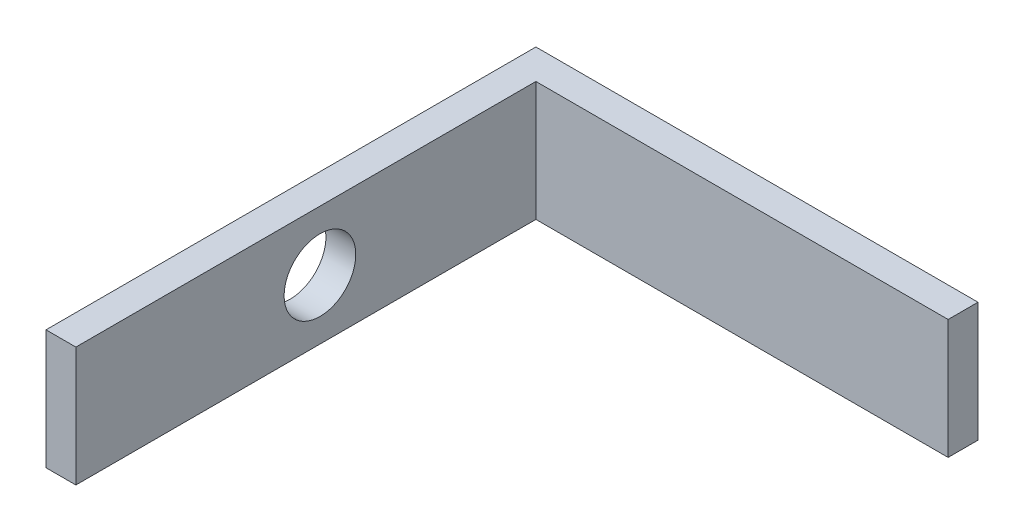
ISO-10303-21;
HEADER;
FILE_DESCRIPTION(('STEP AP214'),'2;1');
FILE_NAME('part.step','',(''),(''),'','','');
FILE_SCHEMA(('AUTOMOTIVE_DESIGN { 1 0 10303 214 1 1 1 1 }'));
ENDSEC;
DATA;
#1=APPLICATION_CONTEXT('core data for automotive mechanical design processes');
#2=APPLICATION_PROTOCOL_DEFINITION('international standard','automotive_design',2000,#1);
#3=PRODUCT_CONTEXT('',#1,'mechanical');
#4=PRODUCT('Part','Part','',(#3));
#5=PRODUCT_RELATED_PRODUCT_CATEGORY('part','',(#4));
#6=PRODUCT_DEFINITION_FORMATION('','',#4);
#7=PRODUCT_DEFINITION_CONTEXT('part definition',#1,'design');
#8=PRODUCT_DEFINITION('design','',#6,#7);
#9=PRODUCT_DEFINITION_SHAPE('','',#8);
#10=(LENGTH_UNIT() NAMED_UNIT(*) SI_UNIT(.MILLI.,.METRE.));
#11=(NAMED_UNIT(*) PLANE_ANGLE_UNIT() SI_UNIT($,.RADIAN.));
#12=(NAMED_UNIT(*) SI_UNIT($,.STERADIAN.) SOLID_ANGLE_UNIT());
#13=UNCERTAINTY_MEASURE_WITH_UNIT(LENGTH_MEASURE(1.E-05),#10,'distance_accuracy_value','');
#14=(GEOMETRIC_REPRESENTATION_CONTEXT(3) GLOBAL_UNCERTAINTY_ASSIGNED_CONTEXT((#13)) GLOBAL_UNIT_ASSIGNED_CONTEXT((#10,
#11,#12)) REPRESENTATION_CONTEXT('',''));
#15=CARTESIAN_POINT('',(0.,0.,0.));
#16=DIRECTION('',(0.,0.,1.));
#17=DIRECTION('',(1.,0.,0.));
#18=AXIS2_PLACEMENT_3D('',#15,#16,#17);
#19=CARTESIAN_POINT('',(-2.75770809575521,7.9375,-45.2264127703854));
#20=DIRECTION('',(0.,0.,1.));
#21=DIRECTION('',(1.,0.,0.));
#22=AXIS2_PLACEMENT_3D('',#19,#20,#21);
#23=PLANE('',#22);
#24=DIRECTION('',(-1.,0.,0.));
#25=VECTOR('',#24,1.);
#26=CARTESIAN_POINT('',(-2.75770809575521,-7.9375,-45.2264127703854));
#27=LINE('',#26,#25);
#28=CARTESIAN_POINT('',(55.9797919042448,-7.9375,-45.2264127703854));
#29=VERTEX_POINT('',#28);
#30=CARTESIAN_POINT('',(-2.75770809575521,-7.9375,-45.2264127703854));
#31=VERTEX_POINT('',#30);
#32=EDGE_CURVE('E86',#29,#31,#27,.T.);
#33=ORIENTED_EDGE('',*,*,#32,.T.);
#34=DIRECTION('',(0.,-1.,0.));
#35=VECTOR('',#34,1.);
#36=CARTESIAN_POINT('',(-2.75770809575521,7.9375,-45.2264127703854));
#37=LINE('',#36,#35);
#38=CARTESIAN_POINT('',(-2.75770809575521,7.9375,-45.2264127703854));
#39=VERTEX_POINT('',#38);
#40=EDGE_CURVE('E11',#39,#31,#37,.T.);
#41=ORIENTED_EDGE('',*,*,#40,.F.);
#42=DIRECTION('',(-1.,0.,0.));
#43=VECTOR('',#42,1.);
#44=CARTESIAN_POINT('',(6.27967860958227,7.9375,-45.2264127703854));
#45=LINE('',#44,#43);
#46=CARTESIAN_POINT('',(55.9797919042448,7.9375,-45.2264127703854));
#47=VERTEX_POINT('',#46);
#48=EDGE_CURVE('E92',#47,#39,#45,.T.);
#49=ORIENTED_EDGE('',*,*,#48,.F.);
#50=DIRECTION('',(0.,-1.,0.));
#51=VECTOR('',#50,1.);
#52=CARTESIAN_POINT('',(55.9797919042448,7.9375,-45.2264127703854));
#53=LINE('',#52,#51);
#54=EDGE_CURVE('E124',#47,#29,#53,.T.);
#55=ORIENTED_EDGE('',*,*,#54,.T.);
#56=EDGE_LOOP('',(#33,#41,#49,#55));
#57=FACE_BOUND('',#56,.T.);
#58=ADVANCED_FACE('F39',(#57),#23,.F.);
#59=CARTESIAN_POINT('',(-2.75770809575521,7.9375,19.8610872296146));
#60=DIRECTION('',(1.,0.,0.));
#61=DIRECTION('',(0.,0.,-1.));
#62=AXIS2_PLACEMENT_3D('',#59,#60,#61);
#63=PLANE('',#62);
#64=CARTESIAN_POINT('',(-2.75770809575521,0.,-12.5665598417181));
#65=DIRECTION('',(-1.,0.,0.));
#66=DIRECTION('',(0.,0.,1.));
#67=AXIS2_PLACEMENT_3D('',#64,#65,#66);
#68=CIRCLE('',#67,4.7625);
#69=CARTESIAN_POINT('',(-2.75770809575521,0.,-7.80405984171809));
#70=VERTEX_POINT('',#69);
#71=EDGE_CURVE('E172',#70,#70,#68,.T.);
#72=ORIENTED_EDGE('',*,*,#71,.F.);
#73=EDGE_LOOP('',(#72));
#74=FACE_BOUND('',#73,.T.);
#75=DIRECTION('',(0.,0.,1.));
#76=VECTOR('',#75,1.);
#77=CARTESIAN_POINT('',(-2.75770809575521,-7.9375,19.8610872296146));
#78=LINE('',#77,#76);
#79=CARTESIAN_POINT('',(-2.75770809575521,-7.9375,19.8610872296146));
#80=VERTEX_POINT('',#79);
#81=EDGE_CURVE('E130',#31,#80,#78,.T.);
#82=ORIENTED_EDGE('',*,*,#81,.T.);
#83=DIRECTION('',(0.,-1.,0.));
#84=VECTOR('',#83,1.);
#85=CARTESIAN_POINT('',(-2.75770809575521,7.9375,19.8610872296146));
#86=LINE('',#85,#84);
#87=CARTESIAN_POINT('',(-2.75770809575521,7.9375,19.8610872296146));
#88=VERTEX_POINT('',#87);
#89=EDGE_CURVE('E48',#88,#80,#86,.T.);
#90=ORIENTED_EDGE('',*,*,#89,.F.);
#91=DIRECTION('',(0.,0.,1.));
#92=VECTOR('',#91,1.);
#93=CARTESIAN_POINT('',(-2.75770809575521,7.9375,19.8610872296146));
#94=LINE('',#93,#92);
#95=EDGE_CURVE('E163',#39,#88,#94,.T.);
#96=ORIENTED_EDGE('',*,*,#95,.F.);
#97=ORIENTED_EDGE('',*,*,#40,.T.);
#98=EDGE_LOOP('',(#82,#90,#96,#97));
#99=FACE_BOUND('',#98,.T.);
#100=ADVANCED_FACE('F179',(#74,#99),#63,.F.);
#101=CARTESIAN_POINT('',(-2.75770809575521,7.9375,19.8610872296146));
#102=DIRECTION('',(0.,0.,-1.));
#103=DIRECTION('',(-1.,0.,0.));
#104=AXIS2_PLACEMENT_3D('',#101,#102,#103);
#105=PLANE('',#104);
#106=DIRECTION('',(1.,0.,0.));
#107=VECTOR('',#106,1.);
#108=CARTESIAN_POINT('',(-2.75770809575521,-7.9375,19.8610872296146));
#109=LINE('',#108,#107);
#110=CARTESIAN_POINT('',(1.21104190424479,-7.9375,19.8610872296146));
#111=VERTEX_POINT('',#110);
#112=EDGE_CURVE('E134',#80,#111,#109,.T.);
#113=ORIENTED_EDGE('',*,*,#112,.T.);
#114=DIRECTION('',(0.,-1.,0.));
#115=VECTOR('',#114,1.);
#116=CARTESIAN_POINT('',(1.21104190424479,7.9375,19.8610872296146));
#117=LINE('',#116,#115);
#118=CARTESIAN_POINT('',(1.21104190424479,7.9375,19.8610872296146));
#119=VERTEX_POINT('',#118);
#120=EDGE_CURVE('E117',#119,#111,#117,.T.);
#121=ORIENTED_EDGE('',*,*,#120,.F.);
#122=DIRECTION('',(1.,0.,0.));
#123=VECTOR('',#122,1.);
#124=CARTESIAN_POINT('',(-2.75770809575521,7.9375,19.8610872296146));
#125=LINE('',#124,#123);
#126=EDGE_CURVE('E106',#88,#119,#125,.T.);
#127=ORIENTED_EDGE('',*,*,#126,.F.);
#128=ORIENTED_EDGE('',*,*,#89,.T.);
#129=EDGE_LOOP('',(#113,#121,#127,#128));
#130=FACE_BOUND('',#129,.T.);
#131=ADVANCED_FACE('F155',(#130),#105,.F.);
#132=CARTESIAN_POINT('',(1.21104190424479,7.9375,19.8610872296146));
#133=DIRECTION('',(-1.,0.,0.));
#134=DIRECTION('',(0.,0.,1.));
#135=AXIS2_PLACEMENT_3D('',#132,#133,#134);
#136=PLANE('',#135);
#137=CARTESIAN_POINT('',(1.21104190424479,0.,-12.5665598417181));
#138=DIRECTION('',(-1.,0.,0.));
#139=DIRECTION('',(0.,0.,1.));
#140=AXIS2_PLACEMENT_3D('',#137,#138,#139);
#141=CIRCLE('',#140,4.7625);
#142=CARTESIAN_POINT('',(1.21104190424479,0.,-7.80405984171809));
#143=VERTEX_POINT('',#142);
#144=EDGE_CURVE('E131',#143,#143,#141,.F.);
#145=ORIENTED_EDGE('',*,*,#144,.F.);
#146=EDGE_LOOP('',(#145));
#147=FACE_BOUND('',#146,.T.);
#148=DIRECTION('',(0.,0.,-1.));
#149=VECTOR('',#148,1.);
#150=CARTESIAN_POINT('',(1.21104190424479,-7.9375,19.8610872296146));
#151=LINE('',#150,#149);
#152=CARTESIAN_POINT('',(1.21104190424479,-7.9375,-41.2576627703854));
#153=VERTEX_POINT('',#152);
#154=EDGE_CURVE('E115',#111,#153,#151,.T.);
#155=ORIENTED_EDGE('',*,*,#154,.T.);
#156=DIRECTION('',(0.,-1.,0.));
#157=VECTOR('',#156,1.);
#158=CARTESIAN_POINT('',(1.21104190424479,7.9375,-41.2576627703854));
#159=LINE('',#158,#157);
#160=CARTESIAN_POINT('',(1.21104190424479,7.9375,-41.2576627703854));
#161=VERTEX_POINT('',#160);
#162=EDGE_CURVE('E112',#161,#153,#159,.T.);
#163=ORIENTED_EDGE('',*,*,#162,.F.);
#164=DIRECTION('',(0.,0.,-1.));
#165=VECTOR('',#164,1.);
#166=CARTESIAN_POINT('',(1.21104190424479,7.9375,19.8610872296146));
#167=LINE('',#166,#165);
#168=EDGE_CURVE('E100',#119,#161,#167,.T.);
#169=ORIENTED_EDGE('',*,*,#168,.F.);
#170=ORIENTED_EDGE('',*,*,#120,.T.);
#171=EDGE_LOOP('',(#155,#163,#169,#170));
#172=FACE_BOUND('',#171,.T.);
#173=ADVANCED_FACE('F113',(#147,#172),#136,.F.);
#174=CARTESIAN_POINT('',(1.21104190424479,7.9375,-41.2576627703854));
#175=DIRECTION('',(0.,0.,-1.));
#176=DIRECTION('',(-1.,0.,0.));
#177=AXIS2_PLACEMENT_3D('',#174,#175,#176);
#178=PLANE('',#177);
#179=DIRECTION('',(1.,0.,0.));
#180=VECTOR('',#179,1.);
#181=CARTESIAN_POINT('',(1.21104190424479,-7.9375,-41.2576627703854));
#182=LINE('',#181,#180);
#183=CARTESIAN_POINT('',(55.9797919042448,-7.9375,-41.2576627703854));
#184=VERTEX_POINT('',#183);
#185=EDGE_CURVE('E79',#153,#184,#182,.T.);
#186=ORIENTED_EDGE('',*,*,#185,.T.);
#187=DIRECTION('',(0.,-1.,0.));
#188=VECTOR('',#187,1.);
#189=CARTESIAN_POINT('',(55.9797919042448,7.9375,-41.2576627703854));
#190=LINE('',#189,#188);
#191=CARTESIAN_POINT('',(55.9797919042448,7.9375,-41.2576627703854));
#192=VERTEX_POINT('',#191);
#193=EDGE_CURVE('E118',#192,#184,#190,.T.);
#194=ORIENTED_EDGE('',*,*,#193,.F.);
#195=DIRECTION('',(1.,0.,0.));
#196=VECTOR('',#195,1.);
#197=CARTESIAN_POINT('',(1.21104190424479,7.9375,-41.2576627703854));
#198=LINE('',#197,#196);
#199=EDGE_CURVE('E104',#161,#192,#198,.T.);
#200=ORIENTED_EDGE('',*,*,#199,.F.);
#201=ORIENTED_EDGE('',*,*,#162,.T.);
#202=EDGE_LOOP('',(#186,#194,#200,#201));
#203=FACE_BOUND('',#202,.T.);
#204=ADVANCED_FACE('F120',(#203),#178,.F.);
#205=CARTESIAN_POINT('',(55.9797919042448,7.9375,-45.2264127703854));
#206=DIRECTION('',(-1.,0.,0.));
#207=DIRECTION('',(0.,0.,1.));
#208=AXIS2_PLACEMENT_3D('',#205,#206,#207);
#209=PLANE('',#208);
#210=DIRECTION('',(0.,0.,-1.));
#211=VECTOR('',#210,1.);
#212=CARTESIAN_POINT('',(55.9797919042448,-7.9375,-45.2264127703854));
#213=LINE('',#212,#211);
#214=EDGE_CURVE('E141',#184,#29,#213,.T.);
#215=ORIENTED_EDGE('',*,*,#214,.T.);
#216=ORIENTED_EDGE('',*,*,#54,.F.);
#217=DIRECTION('',(0.,0.,-1.));
#218=VECTOR('',#217,1.);
#219=CARTESIAN_POINT('',(55.9797919042448,7.9375,-45.2264127703854));
#220=LINE('',#219,#218);
#221=EDGE_CURVE('E56',#192,#47,#220,.T.);
#222=ORIENTED_EDGE('',*,*,#221,.F.);
#223=ORIENTED_EDGE('',*,*,#193,.T.);
#224=EDGE_LOOP('',(#215,#216,#222,#223));
#225=FACE_BOUND('',#224,.T.);
#226=ADVANCED_FACE('F160',(#225),#209,.F.);
#227=CARTESIAN_POINT('',(0.,7.9375,0.));
#228=DIRECTION('',(0.,-1.,0.));
#229=DIRECTION('',(0.,0.,-1.));
#230=AXIS2_PLACEMENT_3D('',#227,#228,#229);
#231=PLANE('',#230);
#232=ORIENTED_EDGE('',*,*,#48,.T.);
#233=ORIENTED_EDGE('',*,*,#95,.T.);
#234=ORIENTED_EDGE('',*,*,#126,.T.);
#235=ORIENTED_EDGE('',*,*,#168,.T.);
#236=ORIENTED_EDGE('',*,*,#199,.T.);
#237=ORIENTED_EDGE('',*,*,#221,.T.);
#238=EDGE_LOOP('',(#232,#233,#234,#235,#236,#237));
#239=FACE_BOUND('',#238,.T.);
#240=ADVANCED_FACE('F102',(#239),#231,.F.);
#241=CARTESIAN_POINT('',(0.,-7.9375,0.));
#242=DIRECTION('',(0.,-1.,0.));
#243=DIRECTION('',(0.,0.,-1.));
#244=AXIS2_PLACEMENT_3D('',#241,#242,#243);
#245=PLANE('',#244);
#246=ORIENTED_EDGE('',*,*,#32,.F.);
#247=ORIENTED_EDGE('',*,*,#214,.F.);
#248=ORIENTED_EDGE('',*,*,#185,.F.);
#249=ORIENTED_EDGE('',*,*,#154,.F.);
#250=ORIENTED_EDGE('',*,*,#112,.F.);
#251=ORIENTED_EDGE('',*,*,#81,.F.);
#252=EDGE_LOOP('',(#246,#247,#248,#249,#250,#251));
#253=FACE_BOUND('',#252,.T.);
#254=ADVANCED_FACE('F158',(#253),#245,.T.);
#255=CARTESIAN_POINT('',(14.6814260858485,0.,-12.5665598417181));
#256=DIRECTION('',(-1.,0.,0.));
#257=DIRECTION('',(0.,0.,1.));
#258=AXIS2_PLACEMENT_3D('',#255,#256,#257);
#259=CYLINDRICAL_SURFACE('',#258,4.7625);
#260=ORIENTED_EDGE('',*,*,#144,.T.);
#261=EDGE_LOOP('',(#260));
#262=FACE_BOUND('',#261,.T.);
#263=ORIENTED_EDGE('',*,*,#71,.T.);
#264=EDGE_LOOP('',(#263));
#265=FACE_BOUND('',#264,.T.);
#266=ADVANCED_FACE('F177',(#262,#265),#259,.F.);
#267=CLOSED_SHELL('',(#58,#100,#131,#173,#204,#226,#240,#254,#266));
#268=MANIFOLD_SOLID_BREP('B2',#267);
#269=ADVANCED_BREP_SHAPE_REPRESENTATION('',(#18,#268),#14);
#270=SHAPE_DEFINITION_REPRESENTATION(#9,#269);
ENDSEC;
END-ISO-10303-21;
